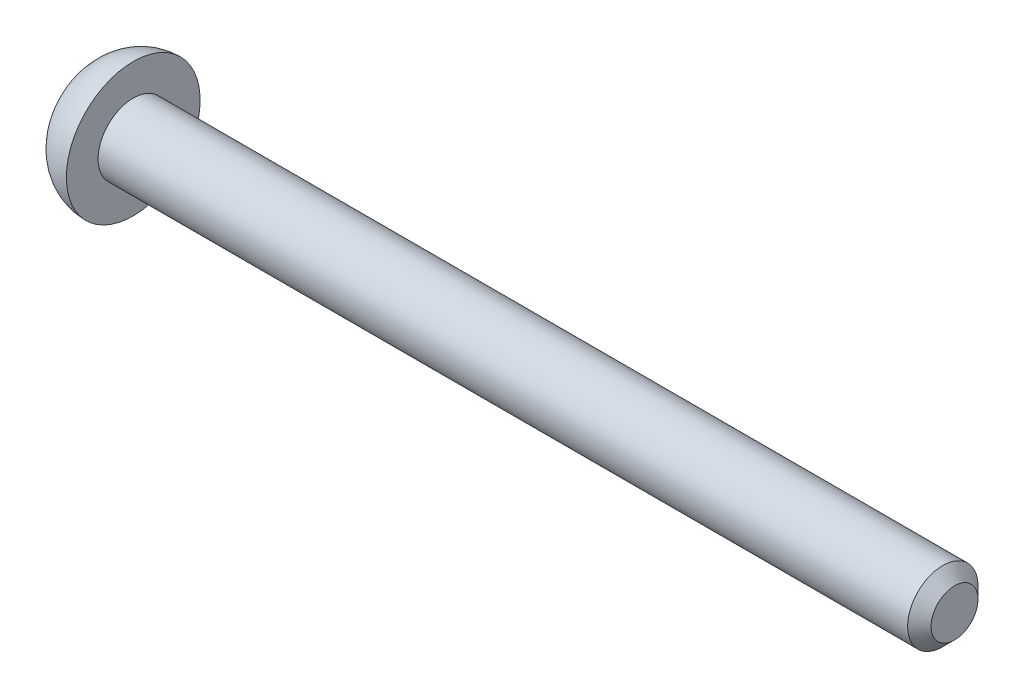
ISO-10303-21;
HEADER;
FILE_DESCRIPTION(('STEP AP214'),'2;1');
FILE_NAME('part.step','',(''),(''),'','','');
FILE_SCHEMA(('AUTOMOTIVE_DESIGN { 1 0 10303 214 1 1 1 1 }'));
ENDSEC;
DATA;
#1=APPLICATION_CONTEXT('core data for automotive mechanical design processes');
#2=APPLICATION_PROTOCOL_DEFINITION('international standard','automotive_design',2000,#1);
#3=PRODUCT_CONTEXT('',#1,'mechanical');
#4=PRODUCT('Part','Part','',(#3));
#5=PRODUCT_RELATED_PRODUCT_CATEGORY('part','',(#4));
#6=PRODUCT_DEFINITION_FORMATION('','',#4);
#7=PRODUCT_DEFINITION_CONTEXT('part definition',#1,'design');
#8=PRODUCT_DEFINITION('design','',#6,#7);
#9=PRODUCT_DEFINITION_SHAPE('','',#8);
#10=(LENGTH_UNIT() NAMED_UNIT(*) SI_UNIT(.MILLI.,.METRE.));
#11=(NAMED_UNIT(*) PLANE_ANGLE_UNIT() SI_UNIT($,.RADIAN.));
#12=(NAMED_UNIT(*) SI_UNIT($,.STERADIAN.) SOLID_ANGLE_UNIT());
#13=UNCERTAINTY_MEASURE_WITH_UNIT(LENGTH_MEASURE(1.E-05),#10,'distance_accuracy_value','');
#14=(GEOMETRIC_REPRESENTATION_CONTEXT(3) GLOBAL_UNCERTAINTY_ASSIGNED_CONTEXT((#13)) GLOBAL_UNIT_ASSIGNED_CONTEXT((#10,
#11,#12)) REPRESENTATION_CONTEXT('',''));
#15=CARTESIAN_POINT('',(0.,0.,0.));
#16=DIRECTION('',(0.,0.,1.));
#17=DIRECTION('',(1.,0.,0.));
#18=AXIS2_PLACEMENT_3D('',#15,#16,#17);
#19=CARTESIAN_POINT('',(-36.65,0.,-2.04903810567666));
#20=DIRECTION('',(1.,0.,0.));
#21=DIRECTION('',(0.,0.,-1.));
#22=AXIS2_PLACEMENT_3D('',#19,#20,#21);
#23=PLANE('',#22);
#24=CARTESIAN_POINT('',(-36.65,0.,0.));
#25=DIRECTION('',(-1.,0.,0.));
#26=DIRECTION('',(0.,0.,1.));
#27=AXIS2_PLACEMENT_3D('',#24,#25,#26);
#28=CIRCLE('',#27,2.04903810567666);
#29=CARTESIAN_POINT('',(-36.65,0.,2.04903810567666));
#30=VERTEX_POINT('',#29);
#31=EDGE_CURVE('E214',#30,#30,#28,.T.);
#32=ORIENTED_EDGE('',*,*,#31,.T.);
#33=EDGE_LOOP('',(#32));
#34=FACE_BOUND('',#33,.T.);
#35=CARTESIAN_POINT('',(-36.65,2.04903810567666,0.));
#36=DIRECTION('',(1.,0.,0.));
#37=DIRECTION('',(0.,0.,1.));
#38=AXIS2_PLACEMENT_3D('',#35,#36,#37);
#39=CIRCLE('',#38,1.02907378905691);
#40=CARTESIAN_POINT('',(-36.65,1.20759961003623,0.592430689092257));
#41=VERTEX_POINT('',#40);
#42=CARTESIAN_POINT('',(-36.65,1.20759961003623,-0.592430689092258));
#43=VERTEX_POINT('',#42);
#44=EDGE_CURVE('E160',#41,#43,#39,.T.);
#45=ORIENTED_EDGE('',*,*,#44,.F.);
#46=CARTESIAN_POINT('',(-36.65,1.12583302491977,0.650000000000001));
#47=DIRECTION('',(-1.,0.,0.));
#48=DIRECTION('',(0.,0.,1.));
#49=AXIS2_PLACEMENT_3D('',#46,#47,#48);
#50=CIRCLE('',#49,0.1);
#51=CARTESIAN_POINT('',(-36.65,1.11685983175353,0.74959659534543));
#52=VERTEX_POINT('',#51);
#53=EDGE_CURVE('E50',#52,#41,#50,.T.);
#54=ORIENTED_EDGE('',*,*,#53,.F.);
#55=CARTESIAN_POINT('',(-36.65,1.02451905283833,1.77451905283833));
#56=DIRECTION('',(1.,0.,0.));
#57=DIRECTION('',(0.,0.,1.));
#58=AXIS2_PLACEMENT_3D('',#55,#56,#57);
#59=CIRCLE('',#58,1.02907378905691);
#60=CARTESIAN_POINT('',(-36.65,0.0907397782827011,1.34202728443769));
#61=VERTEX_POINT('',#60);
#62=EDGE_CURVE('E187',#61,#52,#59,.T.);
#63=ORIENTED_EDGE('',*,*,#62,.F.);
#64=CARTESIAN_POINT('',(-36.65,0.,1.3));
#65=DIRECTION('',(-1.,0.,0.));
#66=DIRECTION('',(0.,0.,1.));
#67=AXIS2_PLACEMENT_3D('',#64,#65,#66);
#68=CIRCLE('',#67,0.1);
#69=CARTESIAN_POINT('',(-36.65,-0.0907397782827009,1.34202728443769));
#70=VERTEX_POINT('',#69);
#71=EDGE_CURVE('E185',#70,#61,#68,.T.);
#72=ORIENTED_EDGE('',*,*,#71,.F.);
#73=CARTESIAN_POINT('',(-36.65,-1.02451905283833,1.77451905283833));
#74=DIRECTION('',(1.,0.,0.));
#75=DIRECTION('',(0.,0.,1.));
#76=AXIS2_PLACEMENT_3D('',#73,#74,#75);
#77=CIRCLE('',#76,1.02907378905691);
#78=CARTESIAN_POINT('',(-36.65,-1.11685983175353,0.74959659534543));
#79=VERTEX_POINT('',#78);
#80=EDGE_CURVE('E134',#79,#70,#77,.T.);
#81=ORIENTED_EDGE('',*,*,#80,.F.);
#82=CARTESIAN_POINT('',(-36.65,-1.12583302491977,0.650000000000001));
#83=DIRECTION('',(-1.,0.,0.));
#84=DIRECTION('',(0.,0.,-1.));
#85=AXIS2_PLACEMENT_3D('',#82,#83,#84);
#86=CIRCLE('',#85,0.0999999999999997);
#87=CARTESIAN_POINT('',(-36.65,-1.20759961003623,0.592430689092258));
#88=VERTEX_POINT('',#87);
#89=EDGE_CURVE('E181',#88,#79,#86,.T.);
#90=ORIENTED_EDGE('',*,*,#89,.F.);
#91=CARTESIAN_POINT('',(-36.65,-2.04903810567666,0.));
#92=DIRECTION('',(1.,0.,0.));
#93=DIRECTION('',(0.,0.,-1.));
#94=AXIS2_PLACEMENT_3D('',#91,#92,#93);
#95=CIRCLE('',#94,1.02907378905691);
#96=CARTESIAN_POINT('',(-36.65,-1.20759961003623,-0.592430689092258));
#97=VERTEX_POINT('',#96);
#98=EDGE_CURVE('E178',#97,#88,#95,.T.);
#99=ORIENTED_EDGE('',*,*,#98,.F.);
#100=CARTESIAN_POINT('',(-36.65,-1.12583302491977,-0.650000000000001));
#101=DIRECTION('',(-1.,0.,0.));
#102=DIRECTION('',(0.,0.,1.));
#103=AXIS2_PLACEMENT_3D('',#100,#101,#102);
#104=CIRCLE('',#103,0.0999999999999999);
#105=CARTESIAN_POINT('',(-36.65,-1.11685983175353,-0.749596595345431));
#106=VERTEX_POINT('',#105);
#107=EDGE_CURVE('E175',#106,#97,#104,.T.);
#108=ORIENTED_EDGE('',*,*,#107,.F.);
#109=CARTESIAN_POINT('',(-36.65,-1.02451905283833,-1.77451905283833));
#110=DIRECTION('',(1.,0.,0.));
#111=DIRECTION('',(0.,0.,1.));
#112=AXIS2_PLACEMENT_3D('',#109,#110,#111);
#113=CIRCLE('',#112,1.02907378905691);
#114=CARTESIAN_POINT('',(-36.65,-0.0907397782827007,-1.34202728443769));
#115=VERTEX_POINT('',#114);
#116=EDGE_CURVE('E172',#115,#106,#113,.T.);
#117=ORIENTED_EDGE('',*,*,#116,.F.);
#118=CARTESIAN_POINT('',(-36.65,0.,-1.3));
#119=DIRECTION('',(-1.,0.,0.));
#120=DIRECTION('',(0.,0.,1.));
#121=AXIS2_PLACEMENT_3D('',#118,#119,#120);
#122=CIRCLE('',#121,0.1);
#123=CARTESIAN_POINT('',(-36.65,0.0907397782827007,-1.34202728443769));
#124=VERTEX_POINT('',#123);
#125=EDGE_CURVE('E169',#124,#115,#122,.T.);
#126=ORIENTED_EDGE('',*,*,#125,.F.);
#127=CARTESIAN_POINT('',(-36.65,1.02451905283833,-1.77451905283833));
#128=DIRECTION('',(1.,0.,0.));
#129=DIRECTION('',(0.,0.,1.));
#130=AXIS2_PLACEMENT_3D('',#127,#128,#129);
#131=CIRCLE('',#130,1.02907378905691);
#132=CARTESIAN_POINT('',(-36.65,1.11685983175353,-0.74959659534543));
#133=VERTEX_POINT('',#132);
#134=EDGE_CURVE('E166',#133,#124,#131,.T.);
#135=ORIENTED_EDGE('',*,*,#134,.F.);
#136=CARTESIAN_POINT('',(-36.65,1.12583302491977,-0.650000000000001));
#137=DIRECTION('',(-1.,0.,0.));
#138=DIRECTION('',(0.,0.,-1.));
#139=AXIS2_PLACEMENT_3D('',#136,#137,#138);
#140=CIRCLE('',#139,0.0999999999999998);
#141=EDGE_CURVE('E163',#43,#133,#140,.T.);
#142=ORIENTED_EDGE('',*,*,#141,.F.);
#143=EDGE_LOOP('',(#45,#54,#63,#72,#81,#90,#99,#108,#117,#126,#135,#142));
#144=FACE_BOUND('',#143,.T.);
#145=ADVANCED_FACE('F35',(#34,#144),#23,.F.);
#146=CARTESIAN_POINT('',(-35.,0.,0.));
#147=DIRECTION('',(-1.,0.,0.));
#148=DIRECTION('',(0.,0.,1.));
#149=AXIS2_PLACEMENT_3D('',#146,#147,#148);
#150=DEGENERATE_TOROIDAL_SURFACE('',#149,0.749999999999998,2.1,.T.);
#151=ORIENTED_EDGE('',*,*,#31,.F.);
#152=EDGE_LOOP('',(#151));
#153=FACE_BOUND('',#152,.T.);
#154=CARTESIAN_POINT('',(-35.,0.,0.));
#155=DIRECTION('',(-1.,0.,0.));
#156=DIRECTION('',(0.,0.,1.));
#157=AXIS2_PLACEMENT_3D('',#154,#155,#156);
#158=CIRCLE('',#157,2.85);
#159=CARTESIAN_POINT('',(-35.,0.,2.85));
#160=VERTEX_POINT('',#159);
#161=EDGE_CURVE('E211',#160,#160,#158,.T.);
#162=ORIENTED_EDGE('',*,*,#161,.T.);
#163=EDGE_LOOP('',(#162));
#164=FACE_BOUND('',#163,.T.);
#165=ADVANCED_FACE('F236',(#153,#164),#150,.T.);
#166=CARTESIAN_POINT('',(-35.,0.,-2.85));
#167=DIRECTION('',(-1.,0.,0.));
#168=DIRECTION('',(0.,0.,1.));
#169=AXIS2_PLACEMENT_3D('',#166,#167,#168);
#170=PLANE('',#169);
#171=ORIENTED_EDGE('',*,*,#161,.F.);
#172=EDGE_LOOP('',(#171));
#173=FACE_BOUND('',#172,.T.);
#174=CARTESIAN_POINT('',(-35.,0.,0.));
#175=DIRECTION('',(-1.,0.,0.));
#176=DIRECTION('',(0.,0.,1.));
#177=AXIS2_PLACEMENT_3D('',#174,#175,#176);
#178=CIRCLE('',#177,1.5);
#179=CARTESIAN_POINT('',(-35.,0.,1.5));
#180=VERTEX_POINT('',#179);
#181=EDGE_CURVE('E191',#180,#180,#178,.T.);
#182=ORIENTED_EDGE('',*,*,#181,.T.);
#183=EDGE_LOOP('',(#182));
#184=FACE_BOUND('',#183,.T.);
#185=ADVANCED_FACE('F241',(#173,#184),#170,.F.);
#186=CARTESIAN_POINT('',(-36.65,0.,0.));
#187=DIRECTION('',(-1.,0.,0.));
#188=DIRECTION('',(0.,0.,1.));
#189=AXIS2_PLACEMENT_3D('',#186,#187,#188);
#190=CYLINDRICAL_SURFACE('',#189,1.5);
#191=CARTESIAN_POINT('',(-0.500000000000007,0.,0.));
#192=DIRECTION('',(-1.,0.,0.));
#193=DIRECTION('',(0.,0.,1.));
#194=AXIS2_PLACEMENT_3D('',#191,#192,#193);
#195=CIRCLE('',#194,1.5);
#196=CARTESIAN_POINT('',(-0.500000000000007,0.,1.5));
#197=VERTEX_POINT('',#196);
#198=EDGE_CURVE('E43',#197,#197,#195,.T.);
#199=ORIENTED_EDGE('',*,*,#198,.T.);
#200=EDGE_LOOP('',(#199));
#201=FACE_BOUND('',#200,.T.);
#202=ORIENTED_EDGE('',*,*,#181,.F.);
#203=EDGE_LOOP('',(#202));
#204=FACE_BOUND('',#203,.T.);
#205=ADVANCED_FACE('F219',(#201,#204),#190,.T.);
#206=CARTESIAN_POINT('',(0.,0.,0.));
#207=DIRECTION('',(-1.,0.,0.));
#208=DIRECTION('',(0.,0.,1.));
#209=AXIS2_PLACEMENT_3D('',#206,#207,#208);
#210=PLANE('',#209);
#211=CARTESIAN_POINT('',(0.,0.,0.));
#212=DIRECTION('',(-1.,0.,0.));
#213=DIRECTION('',(0.,0.,1.));
#214=AXIS2_PLACEMENT_3D('',#211,#212,#213);
#215=CIRCLE('',#214,0.999999999999987);
#216=CARTESIAN_POINT('',(0.,0.,0.999999999999987));
#217=VERTEX_POINT('',#216);
#218=EDGE_CURVE('E11',#217,#217,#215,.F.);
#219=ORIENTED_EDGE('',*,*,#218,.T.);
#220=EDGE_LOOP('',(#219));
#221=FACE_BOUND('',#220,.T.);
#222=ADVANCED_FACE('F224',(#221),#210,.F.);
#223=CARTESIAN_POINT('',(-0.500000000000007,0.,0.));
#224=DIRECTION('',(-1.,0.,0.));
#225=DIRECTION('',(0.,0.,1.));
#226=AXIS2_PLACEMENT_3D('',#223,#224,#225);
#227=CONICAL_SURFACE('',#226,1.5,0.785398163397451);
#228=ORIENTED_EDGE('',*,*,#218,.F.);
#229=EDGE_LOOP('',(#228));
#230=FACE_BOUND('',#229,.T.);
#231=ORIENTED_EDGE('',*,*,#198,.F.);
#232=EDGE_LOOP('',(#231));
#233=FACE_BOUND('',#232,.T.);
#234=ADVANCED_FACE('F37',(#230,#233),#227,.T.);
#235=CARTESIAN_POINT('',(-35.65,1.12583302491977,0.650000000000001));
#236=DIRECTION('',(-1.,0.,0.));
#237=DIRECTION('',(0.,0.,1.));
#238=AXIS2_PLACEMENT_3D('',#235,#236,#237);
#239=CYLINDRICAL_SURFACE('',#238,0.1);
#240=ORIENTED_EDGE('',*,*,#53,.T.);
#241=DIRECTION('',(-1.,0.,0.));
#242=VECTOR('',#241,1.);
#243=CARTESIAN_POINT('',(-35.65,1.20759961003623,0.592430689092257));
#244=LINE('',#243,#242);
#245=CARTESIAN_POINT('',(-35.65,1.20759961003623,0.592430689092257));
#246=VERTEX_POINT('',#245);
#247=EDGE_CURVE('E98',#246,#41,#244,.T.);
#248=ORIENTED_EDGE('',*,*,#247,.F.);
#249=CARTESIAN_POINT('',(-35.65,1.12583302491977,0.650000000000001));
#250=DIRECTION('',(-1.,0.,0.));
#251=DIRECTION('',(0.,0.,1.));
#252=AXIS2_PLACEMENT_3D('',#249,#250,#251);
#253=CIRCLE('',#252,0.1);
#254=CARTESIAN_POINT('',(-35.65,1.11685983175353,0.74959659534543));
#255=VERTEX_POINT('',#254);
#256=EDGE_CURVE('E189',#255,#246,#253,.T.);
#257=ORIENTED_EDGE('',*,*,#256,.F.);
#258=DIRECTION('',(-1.,0.,0.));
#259=VECTOR('',#258,1.);
#260=CARTESIAN_POINT('',(-35.65,1.11685983175353,0.74959659534543));
#261=LINE('',#260,#259);
#262=EDGE_CURVE('E58',#255,#52,#261,.T.);
#263=ORIENTED_EDGE('',*,*,#262,.T.);
#264=EDGE_LOOP('',(#240,#248,#257,#263));
#265=FACE_BOUND('',#264,.T.);
#266=ADVANCED_FACE('F223',(#265),#239,.F.);
#267=CARTESIAN_POINT('',(-35.65,1.02451905283833,1.77451905283833));
#268=DIRECTION('',(-1.,0.,0.));
#269=DIRECTION('',(0.,0.,1.));
#270=AXIS2_PLACEMENT_3D('',#267,#268,#269);
#271=CYLINDRICAL_SURFACE('',#270,1.02907378905691);
#272=ORIENTED_EDGE('',*,*,#62,.T.);
#273=ORIENTED_EDGE('',*,*,#262,.F.);
#274=CARTESIAN_POINT('',(-35.65,1.02451905283833,1.77451905283833));
#275=DIRECTION('',(1.,0.,0.));
#276=DIRECTION('',(0.,0.,1.));
#277=AXIS2_PLACEMENT_3D('',#274,#275,#276);
#278=CIRCLE('',#277,1.02907378905691);
#279=CARTESIAN_POINT('',(-35.65,0.0907397782827011,1.34202728443769));
#280=VERTEX_POINT('',#279);
#281=EDGE_CURVE('E146',#280,#255,#278,.T.);
#282=ORIENTED_EDGE('',*,*,#281,.F.);
#283=DIRECTION('',(-1.,0.,0.));
#284=VECTOR('',#283,1.);
#285=CARTESIAN_POINT('',(-35.65,0.0907397782827011,1.34202728443769));
#286=LINE('',#285,#284);
#287=EDGE_CURVE('E138',#280,#61,#286,.T.);
#288=ORIENTED_EDGE('',*,*,#287,.T.);
#289=EDGE_LOOP('',(#272,#273,#282,#288));
#290=FACE_BOUND('',#289,.T.);
#291=ADVANCED_FACE('F230',(#290),#271,.T.);
#292=CARTESIAN_POINT('',(-35.65,0.,1.3));
#293=DIRECTION('',(-1.,0.,0.));
#294=DIRECTION('',(0.,0.,1.));
#295=AXIS2_PLACEMENT_3D('',#292,#293,#294);
#296=CYLINDRICAL_SURFACE('',#295,0.1);
#297=ORIENTED_EDGE('',*,*,#71,.T.);
#298=ORIENTED_EDGE('',*,*,#287,.F.);
#299=CARTESIAN_POINT('',(-35.65,0.,1.3));
#300=DIRECTION('',(-1.,0.,0.));
#301=DIRECTION('',(0.,0.,1.));
#302=AXIS2_PLACEMENT_3D('',#299,#300,#301);
#303=CIRCLE('',#302,0.1);
#304=CARTESIAN_POINT('',(-35.65,-0.0907397782827009,1.34202728443769));
#305=VERTEX_POINT('',#304);
#306=EDGE_CURVE('E142',#305,#280,#303,.T.);
#307=ORIENTED_EDGE('',*,*,#306,.F.);
#308=DIRECTION('',(-1.,0.,0.));
#309=VECTOR('',#308,1.);
#310=CARTESIAN_POINT('',(-35.65,-0.0907397782827009,1.34202728443769));
#311=LINE('',#310,#309);
#312=EDGE_CURVE('E127',#305,#70,#311,.T.);
#313=ORIENTED_EDGE('',*,*,#312,.T.);
#314=EDGE_LOOP('',(#297,#298,#307,#313));
#315=FACE_BOUND('',#314,.T.);
#316=ADVANCED_FACE('F143',(#315),#296,.F.);
#317=CARTESIAN_POINT('',(-35.65,-1.02451905283833,1.77451905283833));
#318=DIRECTION('',(-1.,0.,0.));
#319=DIRECTION('',(0.,0.,1.));
#320=AXIS2_PLACEMENT_3D('',#317,#318,#319);
#321=CYLINDRICAL_SURFACE('',#320,1.02907378905691);
#322=ORIENTED_EDGE('',*,*,#80,.T.);
#323=ORIENTED_EDGE('',*,*,#312,.F.);
#324=CARTESIAN_POINT('',(-35.65,-1.02451905283833,1.77451905283833));
#325=DIRECTION('',(1.,0.,0.));
#326=DIRECTION('',(0.,0.,1.));
#327=AXIS2_PLACEMENT_3D('',#324,#325,#326);
#328=CIRCLE('',#327,1.02907378905691);
#329=CARTESIAN_POINT('',(-35.65,-1.11685983175353,0.74959659534543));
#330=VERTEX_POINT('',#329);
#331=EDGE_CURVE('E131',#330,#305,#328,.T.);
#332=ORIENTED_EDGE('',*,*,#331,.F.);
#333=DIRECTION('',(-1.,0.,0.));
#334=VECTOR('',#333,1.);
#335=CARTESIAN_POINT('',(-35.65,-1.11685983175353,0.74959659534543));
#336=LINE('',#335,#334);
#337=EDGE_CURVE('E139',#330,#79,#336,.T.);
#338=ORIENTED_EDGE('',*,*,#337,.T.);
#339=EDGE_LOOP('',(#322,#323,#332,#338));
#340=FACE_BOUND('',#339,.T.);
#341=ADVANCED_FACE('F129',(#340),#321,.T.);
#342=CARTESIAN_POINT('',(-35.65,-1.12583302491977,0.650000000000001));
#343=DIRECTION('',(-1.,0.,0.));
#344=DIRECTION('',(0.,0.,1.));
#345=AXIS2_PLACEMENT_3D('',#342,#343,#344);
#346=CYLINDRICAL_SURFACE('',#345,0.0999999999999997);
#347=ORIENTED_EDGE('',*,*,#89,.T.);
#348=ORIENTED_EDGE('',*,*,#337,.F.);
#349=CARTESIAN_POINT('',(-35.65,-1.12583302491977,0.650000000000001));
#350=DIRECTION('',(-1.,0.,0.));
#351=DIRECTION('',(0.,0.,-1.));
#352=AXIS2_PLACEMENT_3D('',#349,#350,#351);
#353=CIRCLE('',#352,0.0999999999999997);
#354=CARTESIAN_POINT('',(-35.65,-1.20759961003623,0.592430689092258));
#355=VERTEX_POINT('',#354);
#356=EDGE_CURVE('E152',#355,#330,#353,.T.);
#357=ORIENTED_EDGE('',*,*,#356,.F.);
#358=DIRECTION('',(-1.,0.,0.));
#359=VECTOR('',#358,1.);
#360=CARTESIAN_POINT('',(-35.65,-1.20759961003623,0.592430689092258));
#361=LINE('',#360,#359);
#362=EDGE_CURVE('E194',#355,#88,#361,.T.);
#363=ORIENTED_EDGE('',*,*,#362,.T.);
#364=EDGE_LOOP('',(#347,#348,#357,#363));
#365=FACE_BOUND('',#364,.T.);
#366=ADVANCED_FACE('F278',(#365),#346,.F.);
#367=CARTESIAN_POINT('',(-35.65,-2.04903810567666,0.));
#368=DIRECTION('',(-1.,0.,0.));
#369=DIRECTION('',(0.,0.,1.));
#370=AXIS2_PLACEMENT_3D('',#367,#368,#369);
#371=CYLINDRICAL_SURFACE('',#370,1.02907378905691);
#372=ORIENTED_EDGE('',*,*,#98,.T.);
#373=ORIENTED_EDGE('',*,*,#362,.F.);
#374=CARTESIAN_POINT('',(-35.65,-2.04903810567666,0.));
#375=DIRECTION('',(1.,0.,0.));
#376=DIRECTION('',(0.,0.,-1.));
#377=AXIS2_PLACEMENT_3D('',#374,#375,#376);
#378=CIRCLE('',#377,1.02907378905691);
#379=CARTESIAN_POINT('',(-35.65,-1.20759961003623,-0.592430689092258));
#380=VERTEX_POINT('',#379);
#381=EDGE_CURVE('E154',#380,#355,#378,.T.);
#382=ORIENTED_EDGE('',*,*,#381,.F.);
#383=DIRECTION('',(-1.,0.,0.));
#384=VECTOR('',#383,1.);
#385=CARTESIAN_POINT('',(-35.65,-1.20759961003623,-0.592430689092258));
#386=LINE('',#385,#384);
#387=EDGE_CURVE('E196',#380,#97,#386,.T.);
#388=ORIENTED_EDGE('',*,*,#387,.T.);
#389=EDGE_LOOP('',(#372,#373,#382,#388));
#390=FACE_BOUND('',#389,.T.);
#391=ADVANCED_FACE('F274',(#390),#371,.T.);
#392=CARTESIAN_POINT('',(-35.65,-1.12583302491977,-0.650000000000001));
#393=DIRECTION('',(-1.,0.,0.));
#394=DIRECTION('',(0.,0.,1.));
#395=AXIS2_PLACEMENT_3D('',#392,#393,#394);
#396=CYLINDRICAL_SURFACE('',#395,0.0999999999999999);
#397=ORIENTED_EDGE('',*,*,#107,.T.);
#398=ORIENTED_EDGE('',*,*,#387,.F.);
#399=CARTESIAN_POINT('',(-35.65,-1.12583302491977,-0.650000000000001));
#400=DIRECTION('',(-1.,0.,0.));
#401=DIRECTION('',(0.,0.,1.));
#402=AXIS2_PLACEMENT_3D('',#399,#400,#401);
#403=CIRCLE('',#402,0.0999999999999999);
#404=CARTESIAN_POINT('',(-35.65,-1.11685983175353,-0.749596595345431));
#405=VERTEX_POINT('',#404);
#406=EDGE_CURVE('E422',#405,#380,#403,.T.);
#407=ORIENTED_EDGE('',*,*,#406,.F.);
#408=DIRECTION('',(-1.,0.,0.));
#409=VECTOR('',#408,1.);
#410=CARTESIAN_POINT('',(-35.65,-1.11685983175353,-0.749596595345431));
#411=LINE('',#410,#409);
#412=EDGE_CURVE('E198',#405,#106,#411,.T.);
#413=ORIENTED_EDGE('',*,*,#412,.T.);
#414=EDGE_LOOP('',(#397,#398,#407,#413));
#415=FACE_BOUND('',#414,.T.);
#416=ADVANCED_FACE('F270',(#415),#396,.F.);
#417=CARTESIAN_POINT('',(-35.65,-1.02451905283833,-1.77451905283833));
#418=DIRECTION('',(-1.,0.,0.));
#419=DIRECTION('',(0.,0.,1.));
#420=AXIS2_PLACEMENT_3D('',#417,#418,#419);
#421=CYLINDRICAL_SURFACE('',#420,1.02907378905691);
#422=ORIENTED_EDGE('',*,*,#116,.T.);
#423=ORIENTED_EDGE('',*,*,#412,.F.);
#424=CARTESIAN_POINT('',(-35.65,-1.02451905283833,-1.77451905283833));
#425=DIRECTION('',(1.,0.,0.));
#426=DIRECTION('',(0.,0.,1.));
#427=AXIS2_PLACEMENT_3D('',#424,#425,#426);
#428=CIRCLE('',#427,1.02907378905691);
#429=CARTESIAN_POINT('',(-35.65,-0.0907397782827007,-1.34202728443769));
#430=VERTEX_POINT('',#429);
#431=EDGE_CURVE('E419',#430,#405,#428,.T.);
#432=ORIENTED_EDGE('',*,*,#431,.F.);
#433=DIRECTION('',(-1.,0.,0.));
#434=VECTOR('',#433,1.);
#435=CARTESIAN_POINT('',(-35.65,-0.0907397782827007,-1.34202728443769));
#436=LINE('',#435,#434);
#437=EDGE_CURVE('E200',#430,#115,#436,.T.);
#438=ORIENTED_EDGE('',*,*,#437,.T.);
#439=EDGE_LOOP('',(#422,#423,#432,#438));
#440=FACE_BOUND('',#439,.T.);
#441=ADVANCED_FACE('F266',(#440),#421,.T.);
#442=CARTESIAN_POINT('',(-35.65,0.,-1.3));
#443=DIRECTION('',(-1.,0.,0.));
#444=DIRECTION('',(0.,0.,1.));
#445=AXIS2_PLACEMENT_3D('',#442,#443,#444);
#446=CYLINDRICAL_SURFACE('',#445,0.1);
#447=ORIENTED_EDGE('',*,*,#125,.T.);
#448=ORIENTED_EDGE('',*,*,#437,.F.);
#449=CARTESIAN_POINT('',(-35.65,0.,-1.3));
#450=DIRECTION('',(-1.,0.,0.));
#451=DIRECTION('',(0.,0.,1.));
#452=AXIS2_PLACEMENT_3D('',#449,#450,#451);
#453=CIRCLE('',#452,0.1);
#454=CARTESIAN_POINT('',(-35.65,0.0907397782827007,-1.34202728443769));
#455=VERTEX_POINT('',#454);
#456=EDGE_CURVE('E416',#455,#430,#453,.T.);
#457=ORIENTED_EDGE('',*,*,#456,.F.);
#458=DIRECTION('',(-1.,0.,0.));
#459=VECTOR('',#458,1.);
#460=CARTESIAN_POINT('',(-35.65,0.0907397782827007,-1.34202728443769));
#461=LINE('',#460,#459);
#462=EDGE_CURVE('E202',#455,#124,#461,.T.);
#463=ORIENTED_EDGE('',*,*,#462,.T.);
#464=EDGE_LOOP('',(#447,#448,#457,#463));
#465=FACE_BOUND('',#464,.T.);
#466=ADVANCED_FACE('F262',(#465),#446,.F.);
#467=CARTESIAN_POINT('',(-35.65,1.02451905283833,-1.77451905283833));
#468=DIRECTION('',(-1.,0.,0.));
#469=DIRECTION('',(0.,0.,1.));
#470=AXIS2_PLACEMENT_3D('',#467,#468,#469);
#471=CYLINDRICAL_SURFACE('',#470,1.02907378905691);
#472=ORIENTED_EDGE('',*,*,#134,.T.);
#473=ORIENTED_EDGE('',*,*,#462,.F.);
#474=CARTESIAN_POINT('',(-35.65,1.02451905283833,-1.77451905283833));
#475=DIRECTION('',(1.,0.,0.));
#476=DIRECTION('',(0.,0.,1.));
#477=AXIS2_PLACEMENT_3D('',#474,#475,#476);
#478=CIRCLE('',#477,1.02907378905691);
#479=CARTESIAN_POINT('',(-35.65,1.11685983175353,-0.74959659534543));
#480=VERTEX_POINT('',#479);
#481=EDGE_CURVE('E413',#480,#455,#478,.T.);
#482=ORIENTED_EDGE('',*,*,#481,.F.);
#483=DIRECTION('',(-1.,0.,0.));
#484=VECTOR('',#483,1.);
#485=CARTESIAN_POINT('',(-35.65,1.11685983175353,-0.74959659534543));
#486=LINE('',#485,#484);
#487=EDGE_CURVE('E204',#480,#133,#486,.T.);
#488=ORIENTED_EDGE('',*,*,#487,.T.);
#489=EDGE_LOOP('',(#472,#473,#482,#488));
#490=FACE_BOUND('',#489,.T.);
#491=ADVANCED_FACE('F258',(#490),#471,.T.);
#492=CARTESIAN_POINT('',(-35.65,1.12583302491977,-0.650000000000001));
#493=DIRECTION('',(-1.,0.,0.));
#494=DIRECTION('',(0.,0.,1.));
#495=AXIS2_PLACEMENT_3D('',#492,#493,#494);
#496=CYLINDRICAL_SURFACE('',#495,0.0999999999999998);
#497=ORIENTED_EDGE('',*,*,#141,.T.);
#498=ORIENTED_EDGE('',*,*,#487,.F.);
#499=CARTESIAN_POINT('',(-35.65,1.12583302491977,-0.650000000000001));
#500=DIRECTION('',(-1.,0.,0.));
#501=DIRECTION('',(0.,0.,-1.));
#502=AXIS2_PLACEMENT_3D('',#499,#500,#501);
#503=CIRCLE('',#502,0.0999999999999998);
#504=CARTESIAN_POINT('',(-35.65,1.20759961003623,-0.592430689092258));
#505=VERTEX_POINT('',#504);
#506=EDGE_CURVE('E408',#505,#480,#503,.T.);
#507=ORIENTED_EDGE('',*,*,#506,.F.);
#508=DIRECTION('',(-1.,0.,0.));
#509=VECTOR('',#508,1.);
#510=CARTESIAN_POINT('',(-35.65,1.20759961003623,-0.592430689092258));
#511=LINE('',#510,#509);
#512=EDGE_CURVE('E206',#505,#43,#511,.T.);
#513=ORIENTED_EDGE('',*,*,#512,.T.);
#514=EDGE_LOOP('',(#497,#498,#507,#513));
#515=FACE_BOUND('',#514,.T.);
#516=ADVANCED_FACE('F254',(#515),#496,.F.);
#517=CARTESIAN_POINT('',(-35.65,2.04903810567666,0.));
#518=DIRECTION('',(-1.,0.,0.));
#519=DIRECTION('',(0.,0.,1.));
#520=AXIS2_PLACEMENT_3D('',#517,#518,#519);
#521=CYLINDRICAL_SURFACE('',#520,1.02907378905691);
#522=ORIENTED_EDGE('',*,*,#44,.T.);
#523=ORIENTED_EDGE('',*,*,#512,.F.);
#524=CARTESIAN_POINT('',(-35.65,2.04903810567666,0.));
#525=DIRECTION('',(1.,0.,0.));
#526=DIRECTION('',(0.,0.,1.));
#527=AXIS2_PLACEMENT_3D('',#524,#525,#526);
#528=CIRCLE('',#527,1.02907378905691);
#529=EDGE_CURVE('E406',#246,#505,#528,.T.);
#530=ORIENTED_EDGE('',*,*,#529,.F.);
#531=ORIENTED_EDGE('',*,*,#247,.T.);
#532=EDGE_LOOP('',(#522,#523,#530,#531));
#533=FACE_BOUND('',#532,.T.);
#534=ADVANCED_FACE('F251',(#533),#521,.T.);
#535=CARTESIAN_POINT('',(-35.65,1.58743556529821,0.325));
#536=DIRECTION('',(-1.,0.,0.));
#537=DIRECTION('',(0.,0.,1.));
#538=AXIS2_PLACEMENT_3D('',#535,#536,#537);
#539=PLANE('',#538);
#540=ORIENTED_EDGE('',*,*,#256,.T.);
#541=ORIENTED_EDGE('',*,*,#529,.T.);
#542=ORIENTED_EDGE('',*,*,#506,.T.);
#543=ORIENTED_EDGE('',*,*,#481,.T.);
#544=ORIENTED_EDGE('',*,*,#456,.T.);
#545=ORIENTED_EDGE('',*,*,#431,.T.);
#546=ORIENTED_EDGE('',*,*,#406,.T.);
#547=ORIENTED_EDGE('',*,*,#381,.T.);
#548=ORIENTED_EDGE('',*,*,#356,.T.);
#549=ORIENTED_EDGE('',*,*,#331,.T.);
#550=ORIENTED_EDGE('',*,*,#306,.T.);
#551=ORIENTED_EDGE('',*,*,#281,.T.);
#552=EDGE_LOOP('',(#540,#541,#542,#543,#544,#545,#546,#547,#548,#549,#550,#551));
#553=FACE_BOUND('',#552,.T.);
#554=ADVANCED_FACE('F149',(#553),#539,.T.);
#555=CLOSED_SHELL('',(#145,#165,#185,#205,#222,#234,#266,#291,#316,#341,#366,#391,#416,#441,
#466,#491,#516,#534,#554));
#556=MANIFOLD_SOLID_BREP('B2',#555);
#557=ADVANCED_BREP_SHAPE_REPRESENTATION('',(#18,#556),#14);
#558=SHAPE_DEFINITION_REPRESENTATION(#9,#557);
ENDSEC;
END-ISO-10303-21;
